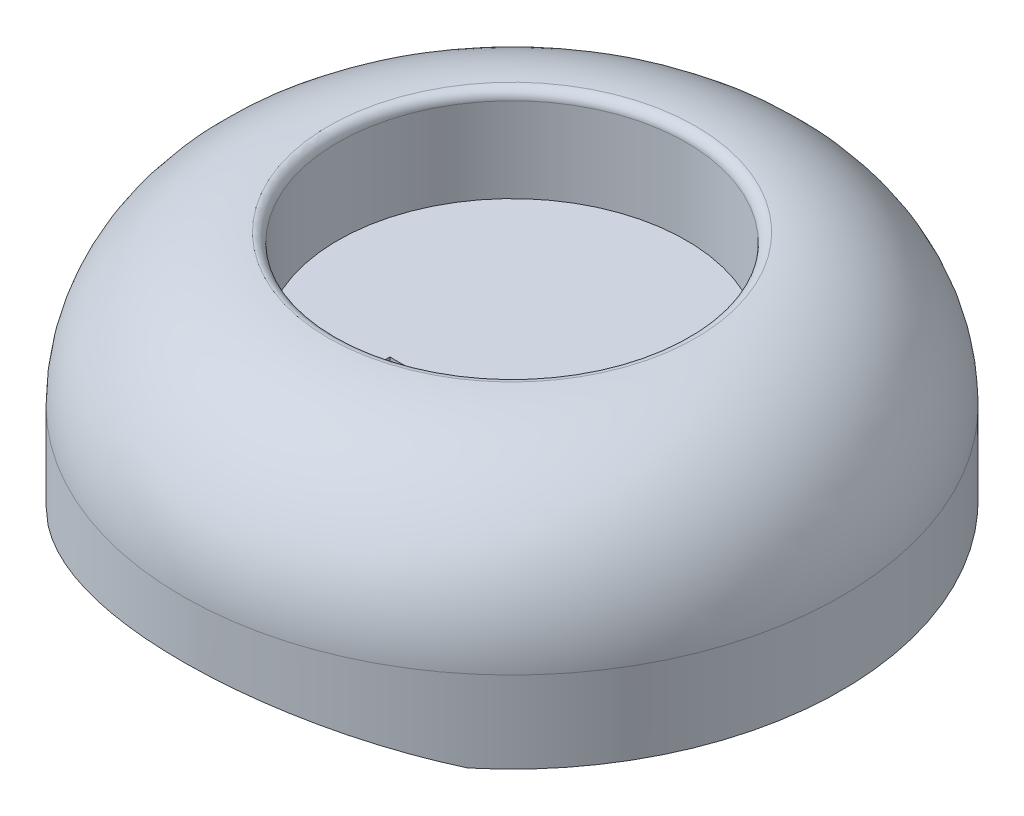
ISO-10303-21;
HEADER;
FILE_DESCRIPTION(('STEP AP214'),'2;1');
FILE_NAME('part.step','',(''),(''),'','','');
FILE_SCHEMA(('AUTOMOTIVE_DESIGN { 1 0 10303 214 1 1 1 1 }'));
ENDSEC;
DATA;
#1=APPLICATION_CONTEXT('core data for automotive mechanical design processes');
#2=APPLICATION_PROTOCOL_DEFINITION('international standard','automotive_design',2000,#1);
#3=PRODUCT_CONTEXT('',#1,'mechanical');
#4=PRODUCT('Part','Part','',(#3));
#5=PRODUCT_RELATED_PRODUCT_CATEGORY('part','',(#4));
#6=PRODUCT_DEFINITION_FORMATION('','',#4);
#7=PRODUCT_DEFINITION_CONTEXT('part definition',#1,'design');
#8=PRODUCT_DEFINITION('design','',#6,#7);
#9=PRODUCT_DEFINITION_SHAPE('','',#8);
#10=(LENGTH_UNIT() NAMED_UNIT(*) SI_UNIT(.MILLI.,.METRE.));
#11=(NAMED_UNIT(*) PLANE_ANGLE_UNIT() SI_UNIT($,.RADIAN.));
#12=(NAMED_UNIT(*) SI_UNIT($,.STERADIAN.) SOLID_ANGLE_UNIT());
#13=UNCERTAINTY_MEASURE_WITH_UNIT(LENGTH_MEASURE(1.E-05),#10,'distance_accuracy_value','');
#14=(GEOMETRIC_REPRESENTATION_CONTEXT(3) GLOBAL_UNCERTAINTY_ASSIGNED_CONTEXT((#13)) GLOBAL_UNIT_ASSIGNED_CONTEXT((#10,
#11,#12)) REPRESENTATION_CONTEXT('',''));
#15=CARTESIAN_POINT('',(0.,0.,0.));
#16=DIRECTION('',(0.,0.,1.));
#17=DIRECTION('',(1.,0.,0.));
#18=AXIS2_PLACEMENT_3D('',#15,#16,#17);
#19=CARTESIAN_POINT('',(0.,3.,0.));
#20=DIRECTION('',(0.,-1.,0.));
#21=DIRECTION('',(0.,0.,-1.));
#22=AXIS2_PLACEMENT_3D('',#19,#20,#21);
#23=CYLINDRICAL_SURFACE('',#22,35.);
#24=CARTESIAN_POINT('',(0.,-2.99218559171947,0.));
#25=DIRECTION('',(0.,1.,0.));
#26=DIRECTION('',(0.,0.,1.));
#27=AXIS2_PLACEMENT_3D('',#24,#25,#26);
#28=CIRCLE('',#27,35.);
#29=CARTESIAN_POINT('',(0.,-2.99218559171947,35.));
#30=VERTEX_POINT('',#29);
#31=EDGE_CURVE('E212',#30,#30,#28,.F.);
#32=ORIENTED_EDGE('',*,*,#31,.T.);
#33=EDGE_LOOP('',(#32));
#34=FACE_BOUND('',#33,.T.);
#35=CARTESIAN_POINT('',(0.,-11.6494555971038,0.));
#36=DIRECTION('',(0.,-1.,0.));
#37=DIRECTION('',(0.,0.,-1.));
#38=AXIS2_PLACEMENT_3D('',#35,#36,#37);
#39=CIRCLE('',#38,35.);
#40=CARTESIAN_POINT('',(22.2795185874538,-11.6494555971038,-26.9930185698321));
#41=VERTEX_POINT('',#40);
#42=CARTESIAN_POINT('',(22.2795185874538,-11.6494555971038,26.9930185698321));
#43=VERTEX_POINT('',#42);
#44=EDGE_CURVE('E153',#41,#43,#39,.T.);
#45=ORIENTED_EDGE('',*,*,#44,.F.);
#46=CARTESIAN_POINT('',(33.2264954516724,-15.,-10.9999999999998));
#47=CARTESIAN_POINT('',(33.070287844172,-14.9416871964574,-11.4718382677305));
#48=CARTESIAN_POINT('',(32.9041710792515,-14.8801344345767,-11.9399190820619));
#49=CARTESIAN_POINT('',(32.5524888540023,-14.751074376007,-12.8678553118098));
#50=CARTESIAN_POINT('',(32.366924399693,-14.6835673873559,-13.3277111512611));
#51=CARTESIAN_POINT('',(31.7818169143331,-14.472975846491,-14.6934141129782));
#52=CARTESIAN_POINT('',(31.3536757056429,-14.3217511034775,-15.5859516390508));
#53=CARTESIAN_POINT('',(30.4255681586325,-14.0026383410802,-17.3279516263963));
#54=CARTESIAN_POINT('',(29.9256992183594,-13.8347730117534,-18.1774704194476));
#55=CARTESIAN_POINT('',(28.857369460363,-13.487196124391,-19.8297767408111));
#56=CARTESIAN_POINT('',(28.28890288945,-13.3074835733194,-20.6325603411243));
#57=CARTESIAN_POINT('',(27.0878725852608,-12.9415529118996,-22.1858088325812));
#58=CARTESIAN_POINT('',(26.4553685677651,-12.7553409666115,-22.9363213844505));
#59=CARTESIAN_POINT('',(25.1298307218605,-12.3814117302299,-24.3814048315343));
#60=CARTESIAN_POINT('',(24.436798096591,-12.1936944691252,-25.0759768381633));
#61=CARTESIAN_POINT('',(22.9941410195863,-11.8217789680604,-26.405146057847));
#62=CARTESIAN_POINT('',(22.2444996923029,-11.6375817981396,-27.0397252585521));
#63=CARTESIAN_POINT('',(20.6932358100137,-11.2777055162001,-28.2445480018689));
#64=CARTESIAN_POINT('',(19.8916125982774,-11.1020265118476,-28.8147907314149));
#65=CARTESIAN_POINT('',(18.2255267935978,-10.7607017408015,-29.8970822606863));
#66=CARTESIAN_POINT('',(17.3601605642291,-10.5953095484316,-30.4078217997207));
#67=CARTESIAN_POINT('',(15.5860577132487,-10.2829474573065,-31.354194854625));
#68=CARTESIAN_POINT('',(14.6773203714802,-10.135977864597,-31.7898271228198));
#69=CARTESIAN_POINT('',(12.8230137224489,-9.86473589875074,-32.5819960995678));
#70=CARTESIAN_POINT('',(11.877455187954,-9.74045694665733,-32.9385557410069));
#71=CARTESIAN_POINT('',(9.95623542194806,-9.51821224744027,-33.5692630051182));
#72=CARTESIAN_POINT('',(8.98057578208915,-9.42024511167963,-33.843414977043));
#73=CARTESIAN_POINT('',(7.0508296343877,-9.2572892842676,-34.2961189186473));
#74=CARTESIAN_POINT('',(6.097722532224,-9.19102432115513,-34.4783902119659));
#75=CARTESIAN_POINT('',(4.17813094282077,-9.0870559242485,-34.7632651362802));
#76=CARTESIAN_POINT('',(3.2116468360348,-9.0493516798556,-34.8658710283091));
#77=CARTESIAN_POINT('',(1.27304273041972,-9.00358316871684,-34.9903209631909));
#78=CARTESIAN_POINT('',(0.300924249474003,-8.99551125982811,-35.0121858290638));
#79=CARTESIAN_POINT('',(-1.64153777444713,-9.00921839014143,-34.9749755320024));
#80=CARTESIAN_POINT('',(-2.61188136190451,-9.03099667068978,-34.9159024261369));
#81=CARTESIAN_POINT('',(-4.49923242050636,-9.10211846265883,-34.72197518562));
#82=CARTESIAN_POINT('',(-5.4166584290202,-9.15016317506512,-34.5906899954895));
#83=CARTESIAN_POINT('',(-7.23655753044753,-9.27163099450366,-34.256213536081));
#84=CARTESIAN_POINT('',(-8.13903116251387,-9.34505318437857,-34.0530248654318));
#85=CARTESIAN_POINT('',(-9.92300168167775,-9.51541374514183,-33.576576416683));
#86=CARTESIAN_POINT('',(-10.804498289911,-9.6123524284621,-33.3033157076279));
#87=CARTESIAN_POINT('',(-12.5409015305293,-9.82733279869941,-32.6890498146642));
#88=CARTESIAN_POINT('',(-13.3958074732976,-9.94537503239255,-32.3480428754794));
#89=CARTESIAN_POINT('',(-15.0889380561709,-10.2019712609943,-31.5942713058427));
#90=CARTESIAN_POINT('',(-15.9265882156743,-10.3408552705166,-31.1803290027825));
#91=CARTESIAN_POINT('',(-17.5640469115699,-10.6340732583566,-30.2881780457692));
#92=CARTESIAN_POINT('',(-18.3638550134748,-10.7884074140034,-29.8099686541692));
#93=CARTESIAN_POINT('',(-19.9217006530582,-11.1088891454027,-28.7922175457386));
#94=CARTESIAN_POINT('',(-20.6797150238464,-11.2750431585103,-28.2526423104519));
#95=CARTESIAN_POINT('',(-21.7817429373516,-11.5300154136964,-27.4002099374963));
#96=CARTESIAN_POINT('',(-22.143267816341,-11.6159667855657,-27.1088743592191));
#97=CARTESIAN_POINT('',(-22.8543384700506,-11.7893002763157,-26.5121609581194));
#98=CARTESIAN_POINT('',(-23.2038812861085,-11.876682740808,-26.2067797100548));
#99=CARTESIAN_POINT('',(-24.2731117253624,-12.1502462488741,-25.2344721130645));
#100=CARTESIAN_POINT('',(-24.9711533434693,-12.3379992602399,-24.5439222370284));
#101=CARTESIAN_POINT('',(-26.306921409847,-12.7123927880997,-23.1064612828754));
#102=CARTESIAN_POINT('',(-26.9446466858193,-12.8990332829048,-22.3595491098172));
#103=CARTESIAN_POINT('',(-27.8526096807546,-13.1741660942054,-21.2007737820457));
#104=CARTESIAN_POINT('',(-28.1470687238969,-13.2650425354061,-20.8082530331569));
#105=CARTESIAN_POINT('',(-28.7193780877013,-13.4445627189195,-20.0109486621318));
#106=CARTESIAN_POINT('',(-28.9972327183075,-13.5332070371288,-19.6061682636518));
#107=CARTESIAN_POINT('',(-29.8051130061001,-13.7948132919814,-18.3744156448791));
#108=CARTESIAN_POINT('',(-30.3097312668621,-13.9635331258057,-17.5296795526715));
#109=CARTESIAN_POINT('',(-31.2675213466198,-14.2915296767312,-15.76061578653));
#110=CARTESIAN_POINT('',(-31.7175119099852,-14.4500792740921,-14.8344250809907));
#111=CARTESIAN_POINT('',(-32.3304720178602,-14.6703433373851,-13.4166134966783));
#112=CARTESIAN_POINT('',(-32.524369619892,-14.7408058560363,-12.9395111091158));
#113=CARTESIAN_POINT('',(-32.891245631117,-14.8753459927725,-11.9762927376035));
#114=CARTESIAN_POINT('',(-33.0642182124596,-14.9394218312254,-11.4901742858574));
#115=CARTESIAN_POINT('',(-33.2264954516724,-15.,-10.9999999999998));
#116=B_SPLINE_CURVE_WITH_KNOTS('',3,(#46,#47,#48,#49,#50,#51,#52,#53,#54,#55,#56,#57,#58,#59,
#60,#61,#62,#63,#64,#65,#66,#67,#68,#69,#70,#71,#72,#73,#74,#75,#76,#77,#78,#79,#80,#81,#82,#83,
#84,#85,#86,#87,#88,#89,#90,#91,#92,#93,#94,#95,#96,#97,#98,#99,#100,#101,#102,#103,#104,#105,
#106,#107,#108,#109,#110,#111,#112,#113,#114,#115),.UNSPECIFIED.,.F.,.F.,(4,2,2,2,2,2,2,2,2,2,2,
2,2,2,2,2,2,2,2,2,2,2,2,2,2,2,2,2,2,2,2,2,2,2,4),(0.,1.50103586598857,3.00199412242077,
6.00215026801031,8.99827043359542,11.9946420545705,14.9882448138711,17.9817880822565,
20.9762273019758,23.9707043603145,27.0219909164407,30.073328155371,33.1237792753978,
36.1740693726364,39.0882781285942,42.0024041715612,44.9157786121871,47.8290790096861,
50.6098740789487,53.3905686591058,56.1713001846226,58.9521037671112,61.7827991952473,
64.6135271164102,67.4458086948596,68.8620689974095,70.2786765261898,73.2740989578896,
76.2695795961657,77.7663105180656,79.2626512364746,82.2539699272729,85.3750490710505,
86.9339667278187,88.4933175657309),.UNSPECIFIED.);
#117=CARTESIAN_POINT('',(-22.2795185874538,-11.6494555971038,-26.9930185698321));
#118=VERTEX_POINT('',#117);
#119=EDGE_CURVE('E169',#41,#118,#116,.T.);
#120=ORIENTED_EDGE('',*,*,#119,.T.);
#121=CARTESIAN_POINT('',(-22.2795185874538,-11.6494555971038,26.9930185698321));
#122=VERTEX_POINT('',#121);
#123=EDGE_CURVE('E157',#122,#118,#39,.T.);
#124=ORIENTED_EDGE('',*,*,#123,.F.);
#125=CARTESIAN_POINT('',(-33.2264954516724,-15.,10.9999999999998));
#126=CARTESIAN_POINT('',(-33.070287844172,-14.9416871964574,11.4718382677305));
#127=CARTESIAN_POINT('',(-32.9041710792515,-14.8801344345767,11.9399190820619));
#128=CARTESIAN_POINT('',(-32.5524888540023,-14.751074376007,12.8678553118098));
#129=CARTESIAN_POINT('',(-32.366924399693,-14.6835673873559,13.3277111512611));
#130=CARTESIAN_POINT('',(-31.7818169143331,-14.472975846491,14.6934141129782));
#131=CARTESIAN_POINT('',(-31.3536757056429,-14.3217511034775,15.5859516390508));
#132=CARTESIAN_POINT('',(-30.4255681586325,-14.0026383410802,17.3279516263963));
#133=CARTESIAN_POINT('',(-29.9256992183594,-13.8347730117534,18.1774704194476));
#134=CARTESIAN_POINT('',(-28.857369460363,-13.487196124391,19.8297767408111));
#135=CARTESIAN_POINT('',(-28.28890288945,-13.3074835733194,20.6325603411243));
#136=CARTESIAN_POINT('',(-27.0878725852608,-12.9415529118996,22.1858088325812));
#137=CARTESIAN_POINT('',(-26.4553685677651,-12.7553409666115,22.9363213844505));
#138=CARTESIAN_POINT('',(-25.1298307218605,-12.3814117302299,24.3814048315343));
#139=CARTESIAN_POINT('',(-24.436798096591,-12.1936944691252,25.0759768381633));
#140=CARTESIAN_POINT('',(-22.9941410195863,-11.8217789680604,26.405146057847));
#141=CARTESIAN_POINT('',(-22.2444996923029,-11.6375817981396,27.0397252585521));
#142=CARTESIAN_POINT('',(-20.6932358100137,-11.2777055162001,28.2445480018689));
#143=CARTESIAN_POINT('',(-19.8916125982774,-11.1020265118476,28.8147907314149));
#144=CARTESIAN_POINT('',(-18.2255267935978,-10.7607017408015,29.8970822606863));
#145=CARTESIAN_POINT('',(-17.3601605642291,-10.5953095484316,30.4078217997207));
#146=CARTESIAN_POINT('',(-15.5860577132487,-10.2829474573065,31.354194854625));
#147=CARTESIAN_POINT('',(-14.6773203714802,-10.135977864597,31.7898271228198));
#148=CARTESIAN_POINT('',(-12.8230137224489,-9.86473589875074,32.5819960995678));
#149=CARTESIAN_POINT('',(-11.877455187954,-9.74045694665733,32.9385557410069));
#150=CARTESIAN_POINT('',(-9.95623542194806,-9.51821224744027,33.5692630051182));
#151=CARTESIAN_POINT('',(-8.98057578208915,-9.42024511167963,33.843414977043));
#152=CARTESIAN_POINT('',(-7.0508296343877,-9.2572892842676,34.2961189186473));
#153=CARTESIAN_POINT('',(-6.097722532224,-9.19102432115513,34.4783902119659));
#154=CARTESIAN_POINT('',(-4.17813094282077,-9.0870559242485,34.7632651362802));
#155=CARTESIAN_POINT('',(-3.2116468360348,-9.0493516798556,34.8658710283091));
#156=CARTESIAN_POINT('',(-1.27304273041972,-9.00358316871684,34.9903209631909));
#157=CARTESIAN_POINT('',(-0.300924249474003,-8.99551125982811,35.0121858290638));
#158=CARTESIAN_POINT('',(1.64153777444713,-9.00921839014143,34.9749755320024));
#159=CARTESIAN_POINT('',(2.61188136190451,-9.03099667068978,34.9159024261369));
#160=CARTESIAN_POINT('',(4.49923242050636,-9.10211846265883,34.72197518562));
#161=CARTESIAN_POINT('',(5.4166584290202,-9.15016317506512,34.5906899954895));
#162=CARTESIAN_POINT('',(7.23655753044753,-9.27163099450366,34.256213536081));
#163=CARTESIAN_POINT('',(8.13903116251387,-9.34505318437857,34.0530248654318));
#164=CARTESIAN_POINT('',(9.92300168167775,-9.51541374514183,33.576576416683));
#165=CARTESIAN_POINT('',(10.804498289911,-9.6123524284621,33.3033157076279));
#166=CARTESIAN_POINT('',(12.5409015305293,-9.82733279869941,32.6890498146642));
#167=CARTESIAN_POINT('',(13.3958074732976,-9.94537503239255,32.3480428754794));
#168=CARTESIAN_POINT('',(15.0889380561709,-10.2019712609943,31.5942713058427));
#169=CARTESIAN_POINT('',(15.9265882156743,-10.3408552705166,31.1803290027825));
#170=CARTESIAN_POINT('',(17.5640469115699,-10.6340732583566,30.2881780457692));
#171=CARTESIAN_POINT('',(18.3638550134748,-10.7884074140034,29.8099686541692));
#172=CARTESIAN_POINT('',(19.9217006530582,-11.1088891454027,28.7922175457386));
#173=CARTESIAN_POINT('',(20.6797150238464,-11.2750431585103,28.2526423104519));
#174=CARTESIAN_POINT('',(21.7817429373516,-11.5300154136964,27.4002099374963));
#175=CARTESIAN_POINT('',(22.143267816341,-11.6159667855657,27.1088743592191));
#176=CARTESIAN_POINT('',(22.8543384700506,-11.7893002763157,26.5121609581194));
#177=CARTESIAN_POINT('',(23.2038812861085,-11.876682740808,26.2067797100548));
#178=CARTESIAN_POINT('',(24.2731117253624,-12.1502462488741,25.2344721130645));
#179=CARTESIAN_POINT('',(24.9711533434693,-12.3379992602399,24.5439222370284));
#180=CARTESIAN_POINT('',(26.306921409847,-12.7123927880997,23.1064612828754));
#181=CARTESIAN_POINT('',(26.9446466858193,-12.8990332829048,22.3595491098172));
#182=CARTESIAN_POINT('',(27.8526096807546,-13.1741660942054,21.2007737820457));
#183=CARTESIAN_POINT('',(28.1470687238969,-13.2650425354061,20.8082530331569));
#184=CARTESIAN_POINT('',(28.7193780877013,-13.4445627189195,20.0109486621318));
#185=CARTESIAN_POINT('',(28.9972327183075,-13.5332070371288,19.6061682636518));
#186=CARTESIAN_POINT('',(29.8051130061001,-13.7948132919814,18.3744156448791));
#187=CARTESIAN_POINT('',(30.3097312668621,-13.9635331258057,17.5296795526715));
#188=CARTESIAN_POINT('',(31.2675213466198,-14.2915296767312,15.76061578653));
#189=CARTESIAN_POINT('',(31.7175119099852,-14.4500792740921,14.8344250809907));
#190=CARTESIAN_POINT('',(32.3304720178602,-14.6703433373851,13.4166134966783));
#191=CARTESIAN_POINT('',(32.524369619892,-14.7408058560363,12.9395111091158));
#192=CARTESIAN_POINT('',(32.891245631117,-14.8753459927725,11.9762927376035));
#193=CARTESIAN_POINT('',(33.0642182124596,-14.9394218312254,11.4901742858574));
#194=CARTESIAN_POINT('',(33.2264954516724,-15.,10.9999999999998));
#195=B_SPLINE_CURVE_WITH_KNOTS('',3,(#125,#126,#127,#128,#129,#130,#131,#132,#133,#134,#135,
#136,#137,#138,#139,#140,#141,#142,#143,#144,#145,#146,#147,#148,#149,#150,#151,#152,#153,#154,
#155,#156,#157,#158,#159,#160,#161,#162,#163,#164,#165,#166,#167,#168,#169,#170,#171,#172,#173,
#174,#175,#176,#177,#178,#179,#180,#181,#182,#183,#184,#185,#186,#187,#188,#189,#190,#191,#192,
#193,#194),.UNSPECIFIED.,.F.,.F.,(4,2,2,2,2,2,2,2,2,2,2,2,2,2,2,2,2,2,2,2,2,2,2,2,2,2,2,2,2,2,2,
2,2,2,4),(0.,1.50103586598857,3.00199412242077,6.00215026801031,8.99827043359542,
11.9946420545705,14.9882448138711,17.9817880822565,20.9762273019758,23.9707043603145,
27.0219909164407,30.073328155371,33.1237792753978,36.1740693726364,39.0882781285942,
42.0024041715612,44.9157786121871,47.8290790096861,50.6098740789487,53.3905686591058,
56.1713001846226,58.9521037671112,61.7827991952473,64.6135271164102,67.4458086948596,
68.8620689974095,70.2786765261898,73.2740989578896,76.2695795961657,77.7663105180656,
79.2626512364746,82.2539699272729,85.3750490710505,86.9339667278187,88.4933175657309),.UNSPECIFIED.);
#196=EDGE_CURVE('E160',#122,#43,#195,.T.);
#197=ORIENTED_EDGE('',*,*,#196,.T.);
#198=EDGE_LOOP('',(#45,#120,#124,#197));
#199=FACE_BOUND('',#198,.T.);
#200=ADVANCED_FACE('F49',(#34,#199),#23,.T.);
#201=CARTESIAN_POINT('',(0.,-104.,-35.));
#202=DIRECTION('',(0.,0.,1.));
#203=DIRECTION('',(1.,0.,0.));
#204=AXIS2_PLACEMENT_3D('',#201,#202,#203);
#205=CYLINDRICAL_SURFACE('',#204,95.);
#206=DIRECTION('',(0.,0.,1.));
#207=VECTOR('',#206,1.);
#208=CARTESIAN_POINT('',(22.2795185874538,-11.6494555971038,-35.));
#209=LINE('',#208,#207);
#210=CARTESIAN_POINT('',(22.2795185874538,-11.6494555971038,23.6616367039835));
#211=VERTEX_POINT('',#210);
#212=EDGE_CURVE('E156',#43,#211,#209,.F.);
#213=ORIENTED_EDGE('',*,*,#212,.F.);
#214=ORIENTED_EDGE('',*,*,#196,.F.);
#215=DIRECTION('',(0.,0.,1.));
#216=VECTOR('',#215,1.);
#217=CARTESIAN_POINT('',(-22.2795185874538,-11.6494555971038,-35.));
#218=LINE('',#217,#216);
#219=CARTESIAN_POINT('',(-22.2795185874538,-11.6494555971038,23.6616367039835));
#220=VERTEX_POINT('',#219);
#221=EDGE_CURVE('E150',#220,#122,#218,.T.);
#222=ORIENTED_EDGE('',*,*,#221,.F.);
#223=CARTESIAN_POINT('',(0.,-8.99999999999997,32.5));
#224=CARTESIAN_POINT('',(0.88531094309566,-8.99999928977968,32.5000010370483));
#225=CARTESIAN_POINT('',(1.77060640750261,-9.01240339699505,32.4637970288554));
#226=CARTESIAN_POINT('',(3.53459194721164,-9.06167717540639,32.3193402093058));
#227=CARTESIAN_POINT('',(4.41328217651195,-9.0985462744112,32.2110890829983));
#228=CARTESIAN_POINT('',(6.15765800307995,-9.19574684254352,31.9235756759847));
#229=CARTESIAN_POINT('',(7.02334321236099,-9.25607901022094,31.744311281046));
#230=CARTESIAN_POINT('',(8.73555163413859,-9.39858243289754,31.3164311282994));
#231=CARTESIAN_POINT('',(9.58207464046565,-9.48075392274875,31.067814624703));
#232=CARTESIAN_POINT('',(11.2487200690982,-9.6645982825525,30.503915853471));
#233=CARTESIAN_POINT('',(12.0688865812897,-9.76623636669711,30.1887524004298));
#234=CARTESIAN_POINT('',(13.6791052009004,-9.98647701491515,29.4940836513536));
#235=CARTESIAN_POINT('',(14.4691574235499,-10.1050795140671,29.1145786015477));
#236=CARTESIAN_POINT('',(16.0144603369805,-10.356260341991,28.2940361550652));
#237=CARTESIAN_POINT('',(16.7697054313538,-10.4888409070154,27.8529889090231));
#238=CARTESIAN_POINT('',(18.2408451388116,-10.7646427967386,26.9125234941527));
#239=CARTESIAN_POINT('',(18.9567387176388,-10.9078644008784,26.4131037922261));
#240=CARTESIAN_POINT('',(20.3679318220489,-11.206227535141,25.3418098152937));
#241=CARTESIAN_POINT('',(21.0617937135384,-11.361605652521,24.7681010616163));
#242=CARTESIAN_POINT('',(22.0646122811582,-11.5972350189727,23.8664016603484));
#243=CARTESIAN_POINT('',(22.392572523743,-11.676209441031,23.558961703717));
#244=CARTESIAN_POINT('',(23.035503273896,-11.8345227699761,22.9307138095416));
#245=CARTESIAN_POINT('',(23.3504705935788,-11.9138617610671,22.6099026296552));
#246=CARTESIAN_POINT('',(24.2750653577167,-12.1516133111408,21.6282051450289));
#247=CARTESIAN_POINT('',(24.8644520234304,-12.309776215973,20.9479951618279));
#248=CARTESIAN_POINT('',(25.9852863109964,-12.6210999226034,19.5403255161225));
#249=CARTESIAN_POINT('',(26.5167341880898,-12.7742607464354,18.8128660617914));
#250=CARTESIAN_POINT('',(27.2754515570309,-12.9993285297492,17.678105815133));
#251=CARTESIAN_POINT('',(27.5253452178457,-13.0746505973342,17.2864486081173));
#252=CARTESIAN_POINT('',(28.0082924546511,-13.222253427729,16.4924662184217));
#253=CARTESIAN_POINT('',(28.2413500649033,-13.2945349173778,16.0901436231832));
#254=CARTESIAN_POINT('',(28.9147135079161,-13.5060171093036,14.867898096818));
#255=CARTESIAN_POINT('',(29.3292533447227,-13.6398685492922,14.0326325493446));
#256=CARTESIAN_POINT('',(30.0857413261065,-13.8889193192554,12.3275345251302));
#257=CARTESIAN_POINT('',(30.4277078230243,-14.0041233630292,11.4577108536566));
#258=CARTESIAN_POINT('',(31.0361020009639,-14.2121174095134,9.68939490445648));
#259=CARTESIAN_POINT('',(31.3025332851925,-14.3049084813438,8.79090399649984));
#260=CARTESIAN_POINT('',(31.749167678357,-14.4620502709056,7.00416138329376));
#261=CARTESIAN_POINT('',(31.9320775173566,-14.5272876423867,6.11666379569649));
#262=CARTESIAN_POINT('',(32.2232755498045,-14.6317476071554,4.3279842516215));
#263=CARTESIAN_POINT('',(32.3315653681648,-14.6709707669231,3.42680259356239));
#264=CARTESIAN_POINT('',(32.4723678201705,-14.7220578033295,1.61802083031138));
#265=CARTESIAN_POINT('',(32.5049019752911,-14.733929450267,0.710422621512716));
#266=CARTESIAN_POINT('',(32.4939050159786,-14.7299254982951,-1.1042369374811));
#267=CARTESIAN_POINT('',(32.4503761998104,-14.7140507377516,-2.01129830306873));
#268=CARTESIAN_POINT('',(32.2916839023467,-14.6565404633657,-3.77381884909994));
#269=CARTESIAN_POINT('',(32.1801006120719,-14.6161929539752,-4.6296454106742));
#270=CARTESIAN_POINT('',(31.8895751621713,-14.5121305675629,-6.32830358467707));
#271=CARTESIAN_POINT('',(31.7106355064299,-14.4484165591622,-7.17113567894575));
#272=CARTESIAN_POINT('',(31.2869863669771,-14.2995272789089,-8.83822527965439));
#273=CARTESIAN_POINT('',(31.0422711582997,-14.2143501389906,-9.66248116248832));
#274=CARTESIAN_POINT('',(30.4891565766833,-14.0250217999379,-11.28706300685));
#275=CARTESIAN_POINT('',(30.1807554331539,-13.9208700732833,-12.0873883023535));
#276=CARTESIAN_POINT('',(29.4969533239799,-13.6946208634692,-13.6724889264707));
#277=CARTESIAN_POINT('',(29.1205204380612,-13.5722529797323,-14.4567820885331));
#278=CARTESIAN_POINT('',(28.5105720083168,-13.3788507389948,-15.607237067662));
#279=CARTESIAN_POINT('',(28.2996946661866,-13.312738137345,-15.9864090615321));
#280=CARTESIAN_POINT('',(27.8631241280208,-13.1776538935426,-16.7357208369017));
#281=CARTESIAN_POINT('',(27.6374277224796,-13.1086816332465,-17.105858637811));
#282=CARTESIAN_POINT('',(26.9386875236265,-12.8981678586162,-18.2018625734323));
#283=CARTESIAN_POINT('',(26.4439670670196,-12.7530211223852,-18.9133676408594));
#284=CARTESIAN_POINT('',(25.39995493512,-12.456914181852,-20.2938734179077));
#285=CARTESIAN_POINT('',(24.8506612227536,-12.3059537606695,-20.9628725393663));
#286=CARTESIAN_POINT('',(23.9724131636989,-12.0738235360516,-21.9495262605568));
#287=CARTESIAN_POINT('',(23.6618954606239,-11.9933594847345,-22.2839139956581));
#288=CARTESIAN_POINT('',(23.0271400826598,-11.8324459058381,-22.9392433470055));
#289=CARTESIAN_POINT('',(22.7029056148786,-11.7519963792323,-23.2601880718097));
#290=CARTESIAN_POINT('',(21.710173282494,-11.5114505907764,-24.2022837540823));
#291=CARTESIAN_POINT('',(21.0216085039104,-11.3521469745374,-24.8027388847133));
#292=CARTESIAN_POINT('',(19.5954700987511,-11.040059746619,-25.9442110321));
#293=CARTESIAN_POINT('',(18.8578907808943,-10.8872768954871,-26.4852211270261));
#294=CARTESIAN_POINT('',(17.3382357013729,-10.5923745425307,-27.5040410246451));
#295=CARTESIAN_POINT('',(16.5561602553799,-10.4502549650736,-27.9818512756207));
#296=CARTESIAN_POINT('',(14.9436604606064,-10.1790926572342,-28.8755264014922));
#297=CARTESIAN_POINT('',(14.1127988476709,-10.0502109984807,-29.2906519287662));
#298=CARTESIAN_POINT('',(12.416307816698,-9.81099316294226,-30.0491028700974));
#299=CARTESIAN_POINT('',(11.550677917477,-9.70065724293486,-30.3924272900387));
#300=CARTESIAN_POINT('',(9.79114019150498,-9.50176120495641,-31.0040449204696));
#301=CARTESIAN_POINT('',(8.89724085869873,-9.41319461494527,-31.2723604344358));
#302=CARTESIAN_POINT('',(7.08771721631026,-9.26041759042454,-31.7314578256634));
#303=CARTESIAN_POINT('',(6.17209396817482,-9.19620596850639,-31.9222434828683));
#304=CARTESIAN_POINT('',(4.36830561360494,-9.09638319925789,-32.2174616298738));
#305=CARTESIAN_POINT('',(3.48078092305064,-9.05960603507679,-32.3254210279235));
#306=CARTESIAN_POINT('',(1.69918094150653,-9.01101762969457,-32.4678501897433));
#307=CARTESIAN_POINT('',(0.805105849787494,-8.99920563216276,-32.5023221798469));
#308=CARTESIAN_POINT('',(-0.982670901847958,-9.00087733980151,-32.4974352863462));
#309=CARTESIAN_POINT('',(-1.87637259856091,-9.01435701642535,-32.4580881609101));
#310=CARTESIAN_POINT('',(-3.65676652170062,-9.06622751618061,-32.305978816669));
#311=CARTESIAN_POINT('',(-4.54345882541975,-9.10461806423166,-32.1932174085473));
#312=CARTESIAN_POINT('',(-6.27602424381416,-9.20368597521681,-31.8999923779286));
#313=CARTESIAN_POINT('',(-7.12231230608969,-9.26363847438008,-31.7217270433408));
#314=CARTESIAN_POINT('',(-8.79634345891885,-9.40438747307228,-31.2988759261241));
#315=CARTESIAN_POINT('',(-9.6240870338705,-9.48518342746063,-31.0542918779889));
#316=CARTESIAN_POINT('',(-11.2557446655881,-9.66558403882619,-30.5008267413524));
#317=CARTESIAN_POINT('',(-12.059656670353,-9.76519031004183,-30.1919401343876));
#318=CARTESIAN_POINT('',(-13.6385997977896,-9.98072709276637,-29.5123278412499));
#319=CARTESIAN_POINT('',(-14.4136300765911,-10.0966580807809,-29.1416003499321));
#320=CARTESIAN_POINT('',(-15.9508583707537,-10.3453555190077,-28.3301176222795));
#321=CARTESIAN_POINT('',(-16.7121434592887,-10.478492294903,-27.8877405640107));
#322=CARTESIAN_POINT('',(-17.8240384663321,-10.686302826791,-27.1798981512438));
#323=CARTESIAN_POINT('',(-18.1896830904932,-10.7569278161787,-26.9365572829151));
#324=CARTESIAN_POINT('',(-18.9106019730717,-10.9004607172096,-26.4354283294217));
#325=CARTESIAN_POINT('',(-19.2658738952959,-10.9733691355905,-26.177637027253));
#326=CARTESIAN_POINT('',(-20.3153060103593,-11.1948312319103,-25.3832251527991));
#327=CARTESIAN_POINT('',(-20.9931130926317,-11.3461275173828,-24.8255471574173));
#328=CARTESIAN_POINT('',(-22.3010013702662,-11.6521977525727,-23.6576422269051));
#329=CARTESIAN_POINT('',(-22.93108121936,-11.8069718002297,-23.0474138104928));
#330=CARTESIAN_POINT('',(-23.8521846911672,-12.0425083167223,-22.0801802806382));
#331=CARTESIAN_POINT('',(-24.1618891207828,-12.1234465591395,-21.7408398726397));
#332=CARTESIAN_POINT('',(-24.7666417436766,-12.2846177044083,-21.0493326842314));
#333=CARTESIAN_POINT('',(-25.0616933653576,-12.3648507686044,-20.6971689379144));
#334=CARTESIAN_POINT('',(-25.9243104322204,-12.6036864469975,-19.6220349783128));
#335=CARTESIAN_POINT('',(-26.469380252853,-12.7604364487752,-18.8803777558882));
#336=CARTESIAN_POINT('',(-27.4954304987582,-13.064375337743,-17.3521932344264));
#337=CARTESIAN_POINT('',(-27.9764077495224,-13.2115637511622,-16.5656637156155));
#338=CARTESIAN_POINT('',(-28.8707326563038,-13.4919866760833,-14.952626651825));
#339=CARTESIAN_POINT('',(-29.2840814751616,-13.6252214274979,-14.1261197945546));
#340=CARTESIAN_POINT('',(-30.0393789268413,-13.8734571208312,-12.4394038538411));
#341=CARTESIAN_POINT('',(-30.3813953706567,-13.9884753547284,-11.5792277102187));
#342=CARTESIAN_POINT('',(-30.9914557787213,-14.1966944954034,-9.83042295941822));
#343=CARTESIAN_POINT('',(-31.2594994232034,-14.2898953078694,-8.94179422926473));
#344=CARTESIAN_POINT('',(-31.7188884768194,-14.4512899648293,-7.14306379538944));
#345=CARTESIAN_POINT('',(-31.9102648726685,-14.5194939113926,-6.23297092466357));
#346=CARTESIAN_POINT('',(-32.2144529400059,-14.6285545601312,-4.39814216187316));
#347=CARTESIAN_POINT('',(-32.327268860332,-14.6694127412608,-3.47340706448075));
#348=CARTESIAN_POINT('',(-32.4691647124526,-14.720894839053,-1.66709094234046));
#349=CARTESIAN_POINT('',(-32.5024427936158,-14.7330342040635,-0.785880393319468));
#350=CARTESIAN_POINT('',(-32.4972783344967,-14.7311535528099,0.976283315602836));
#351=CARTESIAN_POINT('',(-32.4588385024845,-14.7171345243603,1.85723648396711));
#352=CARTESIAN_POINT('',(-32.3106346346368,-14.6633946737513,3.61225613761083));
#353=CARTESIAN_POINT('',(-32.2008754163181,-14.6236755875927,4.48632308400821));
#354=CARTESIAN_POINT('',(-31.911119326363,-14.5198117264607,6.22125040930184));
#355=CARTESIAN_POINT('',(-31.7311222722654,-14.455666888035,7.08211075388446));
#356=CARTESIAN_POINT('',(-31.3071261005779,-14.306560110539,8.76653537640956));
#357=CARTESIAN_POINT('',(-31.0645619230476,-14.2220674027539,9.5905033934565));
#358=CARTESIAN_POINT('',(-30.5158204085671,-14.0340689692722,11.2147005683211));
#359=CARTESIAN_POINT('',(-30.2096443603673,-13.9305636287687,12.0149302066932));
#360=CARTESIAN_POINT('',(-29.536002279156,-13.7074178984042,13.5869780746334));
#361=CARTESIAN_POINT('',(-29.1685256263061,-13.5877747134796,14.3587913529641));
#362=CARTESIAN_POINT('',(-28.3749671897465,-13.3355938993357,15.8694476718525));
#363=CARTESIAN_POINT('',(-27.9488831833238,-13.2030557811255,16.6082894605418));
#364=CARTESIAN_POINT('',(-27.0201433327412,-12.9222440104695,18.0818763723606));
#365=CARTESIAN_POINT('',(-26.5148843503578,-12.7735286597455,18.81490320601));
#366=CARTESIAN_POINT('',(-25.7139051787586,-12.545792105207,19.880712993717));
#367=CARTESIAN_POINT('',(-25.4397134825392,-12.469098161464,20.2303801472128));
#368=CARTESIAN_POINT('',(-24.8772837130367,-12.3146367493435,20.9181288564308));
#369=CARTESIAN_POINT('',(-24.5890423828612,-12.236869035075,21.2562076945933));
#370=CARTESIAN_POINT('',(-23.7039310217213,-12.0027388418934,22.2522491647756));
#371=CARTESIAN_POINT('',(-23.0866432596773,-11.8455405915394,22.8920571356796));
#372=CARTESIAN_POINT('',(-21.8014712196508,-11.5330706732099,24.1191880987403));
#373=CARTESIAN_POINT('',(-21.1335864528262,-11.3777990238652,24.7065105836898));
#374=CARTESIAN_POINT('',(-20.0823185279095,-11.1461545437592,25.557096949401));
#375=CARTESIAN_POINT('',(-19.7158439111407,-11.0676039838119,25.8408661972267));
#376=CARTESIAN_POINT('',(-18.9708938876527,-10.9126757753572,26.3926127074605));
#377=CARTESIAN_POINT('',(-18.5924213366835,-10.8362976178646,26.6605936850269));
#378=CARTESIAN_POINT('',(-17.4396642996877,-10.6111856455306,27.4402714951248));
#379=CARTESIAN_POINT('',(-16.6479869694577,-10.466462428601,27.9277464683577));
#380=CARTESIAN_POINT('',(-15.0239960655217,-10.1919098129575,28.833908639939));
#381=CARTESIAN_POINT('',(-14.1916882404165,-10.062078315947,29.2526055329664));
#382=CARTESIAN_POINT('',(-12.4919097048927,-9.82097507711177,30.017839047031));
#383=CARTESIAN_POINT('',(-11.6244403570335,-9.70970261695077,30.3643784610861));
#384=CARTESIAN_POINT('',(-9.88450751965666,-9.51168170642844,30.9737483275766));
#385=CARTESIAN_POINT('',(-9.01281483042074,-9.4243509511114,31.2385907682874));
#386=CARTESIAN_POINT('',(-7.24836120011981,-9.27278548335666,31.6945019104217));
#387=CARTESIAN_POINT('',(-6.35560061924825,-9.20855037636181,31.88557187215));
#388=CARTESIAN_POINT('',(-4.55598344020185,-9.10503120147978,32.1920165142004));
#389=CARTESIAN_POINT('',(-3.6491306111767,-9.06574057566304,32.3074110899219));
#390=CARTESIAN_POINT('',(-1.8281795762354,-9.01322564156711,32.4614014135798));
#391=CARTESIAN_POINT('',(-0.914081537577586,-9.0000007333008,32.49999892925));
#392=CARTESIAN_POINT('',(0.,-8.99999999999997,32.5));
#393=B_SPLINE_CURVE_WITH_KNOTS('',3,(#223,#224,#225,#226,#227,#228,#229,#230,#231,#232,#233,
#234,#235,#236,#237,#238,#239,#240,#241,#242,#243,#244,#245,#246,#247,#248,#249,#250,#251,#252,
#253,#254,#255,#256,#257,#258,#259,#260,#261,#262,#263,#264,#265,#266,#267,#268,#269,#270,#271,
#272,#273,#274,#275,#276,#277,#278,#279,#280,#281,#282,#283,#284,#285,#286,#287,#288,#289,#290,
#291,#292,#293,#294,#295,#296,#297,#298,#299,#300,#301,#302,#303,#304,#305,#306,#307,#308,#309,
#310,#311,#312,#313,#314,#315,#316,#317,#318,#319,#320,#321,#322,#323,#324,#325,#326,#327,#328,
#329,#330,#331,#332,#333,#334,#335,#336,#337,#338,#339,#340,#341,#342,#343,#344,#345,#346,#347,
#348,#349,#350,#351,#352,#353,#354,#355,#356,#357,#358,#359,#360,#361,#362,#363,#364,#365,#366,
#367,#368,#369,#370,#371,#372,#373,#374,#375,#376,#377,#378,#379,#380,#381,#382,#383,#384,#385,
#386,#387,#388,#389,#390,#391,#392),.UNSPECIFIED.,.T.,.F.,(4,2,2,2,2,2,2,2,2,2,2,2,2,2,2,2,2,2,
2,2,2,2,2,2,2,2,2,2,2,2,2,2,2,2,2,2,2,2,2,2,2,2,2,2,2,2,2,2,2,2,2,2,2,2,2,2,2,2,2,2,2,2,2,2,2,2,
2,2,2,2,2,2,2,2,2,2,2,2,2,2,2,2,2,2,4),(0.,2.65508317469185,5.31010425405897,7.96520438560638,
10.6203330702778,13.2707607109099,15.9211782088381,18.5720203737026,21.2229321761213,
23.9604780851226,25.3293966515041,26.6986491158214,29.436882752039,32.1751043248714,
33.586682861768,34.9979220258861,37.8201637637608,40.6416909607044,43.4630835415322,
46.1850954674127,48.9070481173827,51.6282273916797,54.3493244461678,56.9383220615968,
59.5272234439396,62.1163502318303,64.705549012075,67.3379432684471,68.6542683396904,
69.9708794464149,72.6039359287054,75.2370907329057,76.6268406053638,78.0162673179697,
80.7949472278829,83.5739503474903,86.3529337543014,89.1624910965954,91.9720873357933,
94.7808472665932,97.5894702407601,100.270593359568,102.951635251407,105.632250133727,
108.312835415636,110.910640018723,113.508376685608,116.106336382948,118.704371928403,
121.372623707489,122.70688958777,124.041453695692,126.710472234235,129.379566031229,
130.778693569223,132.177492187789,134.974903651428,137.772453619542,140.569955479978,
143.364785694429,146.159627990092,148.953339547814,151.746899999664,154.389398222705,
157.031796659602,159.674016625024,162.316243454351,164.902558421033,167.488820995143,
170.075532084717,172.662341303659,175.366933867489,176.719384325876,178.072149805356,
180.777527413582,183.482931163099,184.892867960341,186.302471647404,189.121470319374,
191.940071295131,194.758563150287,197.500761662463,200.242913325748,202.984343775703,
205.725711121996),.UNSPECIFIED.);
#394=EDGE_CURVE('E155',#220,#211,#393,.T.);
#395=ORIENTED_EDGE('',*,*,#394,.T.);
#396=EDGE_LOOP('',(#213,#214,#222,#395));
#397=FACE_BOUND('',#396,.T.);
#398=ADVANCED_FACE('F178',(#397),#205,.F.);
#399=CARTESIAN_POINT('',(22.2795185874538,-11.6494555971038,-23.6616367039835));
#400=VERTEX_POINT('',#399);
#401=EDGE_CURVE('E158',#400,#41,#209,.F.);
#402=ORIENTED_EDGE('',*,*,#401,.F.);
#403=CARTESIAN_POINT('',(-22.2795185874538,-11.6494555971038,-23.6616367039835));
#404=VERTEX_POINT('',#403);
#405=EDGE_CURVE('E170',#400,#404,#393,.T.);
#406=ORIENTED_EDGE('',*,*,#405,.T.);
#407=EDGE_CURVE('E152',#118,#404,#218,.T.);
#408=ORIENTED_EDGE('',*,*,#407,.F.);
#409=ORIENTED_EDGE('',*,*,#119,.F.);
#410=EDGE_LOOP('',(#402,#406,#408,#409));
#411=FACE_BOUND('',#410,.T.);
#412=ADVANCED_FACE('F183',(#411),#205,.F.);
#413=CARTESIAN_POINT('',(0.,-15.,0.));
#414=DIRECTION('',(0.,1.,0.));
#415=DIRECTION('',(0.,0.,1.));
#416=AXIS2_PLACEMENT_3D('',#413,#414,#415);
#417=CYLINDRICAL_SURFACE('',#416,32.5);
#418=CARTESIAN_POINT('',(0.,0.,0.));
#419=DIRECTION('',(0.,-1.,0.));
#420=DIRECTION('',(0.,0.,-1.));
#421=AXIS2_PLACEMENT_3D('',#418,#419,#420);
#422=CIRCLE('',#421,32.5);
#423=CARTESIAN_POINT('',(0.,0.,-32.5));
#424=VERTEX_POINT('',#423);
#425=EDGE_CURVE('E198',#424,#424,#422,.T.);
#426=ORIENTED_EDGE('',*,*,#425,.F.);
#427=EDGE_LOOP('',(#426));
#428=FACE_BOUND('',#427,.T.);
#429=ORIENTED_EDGE('',*,*,#405,.F.);
#430=CARTESIAN_POINT('',(0.,-11.6494555971038,0.));
#431=DIRECTION('',(0.,-1.,0.));
#432=DIRECTION('',(0.,0.,-1.));
#433=AXIS2_PLACEMENT_3D('',#430,#431,#432);
#434=CIRCLE('',#433,32.5);
#435=EDGE_CURVE('E202',#400,#211,#434,.T.);
#436=ORIENTED_EDGE('',*,*,#435,.T.);
#437=ORIENTED_EDGE('',*,*,#394,.F.);
#438=EDGE_CURVE('E199',#220,#404,#434,.T.);
#439=ORIENTED_EDGE('',*,*,#438,.T.);
#440=EDGE_LOOP('',(#429,#436,#437,#439));
#441=FACE_BOUND('',#440,.T.);
#442=ADVANCED_FACE('F187',(#428,#441),#417,.F.);
#443=CARTESIAN_POINT('',(0.,0.,0.));
#444=DIRECTION('',(0.,1.,0.));
#445=DIRECTION('',(0.,0.,1.));
#446=AXIS2_PLACEMENT_3D('',#443,#444,#445);
#447=PLANE('',#446);
#448=DIRECTION('',(-1.,0.,0.));
#449=VECTOR('',#448,1.);
#450=CARTESIAN_POINT('',(-5.00579183325768,0.,14.17));
#451=LINE('',#450,#449);
#452=CARTESIAN_POINT('',(4.99420816674232,0.,14.17));
#453=VERTEX_POINT('',#452);
#454=CARTESIAN_POINT('',(-5.00579183325768,0.,14.17));
#455=VERTEX_POINT('',#454);
#456=EDGE_CURVE('E125',#453,#455,#451,.T.);
#457=ORIENTED_EDGE('',*,*,#456,.F.);
#458=DIRECTION('',(0.,0.,1.));
#459=VECTOR('',#458,1.);
#460=CARTESIAN_POINT('',(4.99420816674232,0.,14.17));
#461=LINE('',#460,#459);
#462=CARTESIAN_POINT('',(4.99420816674232,0.,7.97));
#463=VERTEX_POINT('',#462);
#464=EDGE_CURVE('E64',#463,#453,#461,.T.);
#465=ORIENTED_EDGE('',*,*,#464,.F.);
#466=DIRECTION('',(1.,0.,0.));
#467=VECTOR('',#466,1.);
#468=CARTESIAN_POINT('',(-5.00579183325768,0.,7.97));
#469=LINE('',#468,#467);
#470=CARTESIAN_POINT('',(-5.00579183325768,0.,7.97));
#471=VERTEX_POINT('',#470);
#472=EDGE_CURVE('E132',#471,#463,#469,.T.);
#473=ORIENTED_EDGE('',*,*,#472,.F.);
#474=DIRECTION('',(0.,0.,-1.));
#475=VECTOR('',#474,1.);
#476=CARTESIAN_POINT('',(-5.00579183325768,0.,14.17));
#477=LINE('',#476,#475);
#478=EDGE_CURVE('E116',#455,#471,#477,.T.);
#479=ORIENTED_EDGE('',*,*,#478,.F.);
#480=EDGE_LOOP('',(#457,#465,#473,#479));
#481=FACE_BOUND('',#480,.T.);
#482=CARTESIAN_POINT('',(0.,0.,0.));
#483=DIRECTION('',(0.,1.,0.));
#484=DIRECTION('',(0.,0.,1.));
#485=AXIS2_PLACEMENT_3D('',#482,#483,#484);
#486=CIRCLE('',#485,6.5);
#487=CARTESIAN_POINT('',(0.,0.,6.5));
#488=VERTEX_POINT('',#487);
#489=EDGE_CURVE('E215',#488,#488,#486,.F.);
#490=ORIENTED_EDGE('',*,*,#489,.F.);
#491=EDGE_LOOP('',(#490));
#492=FACE_BOUND('',#491,.T.);
#493=ORIENTED_EDGE('',*,*,#425,.T.);
#494=EDGE_LOOP('',(#493));
#495=FACE_BOUND('',#494,.T.);
#496=ADVANCED_FACE('F129',(#481,#492,#495),#447,.F.);
#497=CARTESIAN_POINT('',(-35.,-11.6494555971038,26.9930185698321));
#498=DIRECTION('',(0.,-1.,0.));
#499=DIRECTION('',(0.,0.,-1.));
#500=AXIS2_PLACEMENT_3D('',#497,#498,#499);
#501=PLANE('',#500);
#502=ORIENTED_EDGE('',*,*,#123,.T.);
#503=ORIENTED_EDGE('',*,*,#407,.T.);
#504=ORIENTED_EDGE('',*,*,#438,.F.);
#505=ORIENTED_EDGE('',*,*,#221,.T.);
#506=EDGE_LOOP('',(#502,#503,#504,#505));
#507=FACE_BOUND('',#506,.T.);
#508=ADVANCED_FACE('F269',(#507),#501,.T.);
#509=ORIENTED_EDGE('',*,*,#44,.T.);
#510=ORIENTED_EDGE('',*,*,#212,.T.);
#511=ORIENTED_EDGE('',*,*,#435,.F.);
#512=ORIENTED_EDGE('',*,*,#401,.T.);
#513=EDGE_LOOP('',(#509,#510,#511,#512));
#514=FACE_BOUND('',#513,.T.);
#515=ADVANCED_FACE('F185',(#514),#501,.T.);
#516=CARTESIAN_POINT('',(0.,3.,0.));
#517=DIRECTION('',(0.,1.,0.));
#518=DIRECTION('',(0.,0.,1.));
#519=AXIS2_PLACEMENT_3D('',#516,#517,#518);
#520=PLANE('',#519);
#521=DIRECTION('',(0.,0.,-1.));
#522=VECTOR('',#521,1.);
#523=CARTESIAN_POINT('',(4.99420816674232,3.,0.));
#524=LINE('',#523,#522);
#525=CARTESIAN_POINT('',(4.99420816674232,3.,14.17));
#526=VERTEX_POINT('',#525);
#527=CARTESIAN_POINT('',(4.99420816674232,3.,7.97));
#528=VERTEX_POINT('',#527);
#529=EDGE_CURVE('E12',#526,#528,#524,.T.);
#530=ORIENTED_EDGE('',*,*,#529,.F.);
#531=DIRECTION('',(1.,0.,0.));
#532=VECTOR('',#531,1.);
#533=CARTESIAN_POINT('',(0.,3.,14.17));
#534=LINE('',#533,#532);
#535=CARTESIAN_POINT('',(-5.00579183325768,3.,14.17));
#536=VERTEX_POINT('',#535);
#537=EDGE_CURVE('E218',#536,#526,#534,.T.);
#538=ORIENTED_EDGE('',*,*,#537,.F.);
#539=DIRECTION('',(0.,0.,1.));
#540=VECTOR('',#539,1.);
#541=CARTESIAN_POINT('',(-5.00579183325768,3.,0.));
#542=LINE('',#541,#540);
#543=CARTESIAN_POINT('',(-5.00579183325768,3.,7.97));
#544=VERTEX_POINT('',#543);
#545=EDGE_CURVE('E119',#544,#536,#542,.T.);
#546=ORIENTED_EDGE('',*,*,#545,.F.);
#547=DIRECTION('',(-1.,0.,0.));
#548=VECTOR('',#547,1.);
#549=CARTESIAN_POINT('',(0.,3.,7.97));
#550=LINE('',#549,#548);
#551=EDGE_CURVE('E57',#528,#544,#550,.T.);
#552=ORIENTED_EDGE('',*,*,#551,.F.);
#553=EDGE_LOOP('',(#530,#538,#546,#552));
#554=FACE_BOUND('',#553,.T.);
#555=CARTESIAN_POINT('',(0.,3.,0.));
#556=DIRECTION('',(0.,1.,0.));
#557=DIRECTION('',(0.,0.,1.));
#558=AXIS2_PLACEMENT_3D('',#555,#556,#557);
#559=CIRCLE('',#558,18.5);
#560=CARTESIAN_POINT('',(0.,3.,18.5));
#561=VERTEX_POINT('',#560);
#562=EDGE_CURVE('E203',#561,#561,#559,.F.);
#563=ORIENTED_EDGE('',*,*,#562,.F.);
#564=EDGE_LOOP('',(#563));
#565=FACE_BOUND('',#564,.T.);
#566=ADVANCED_FACE('F226',(#554,#565),#520,.T.);
#567=CARTESIAN_POINT('',(0.,13.,0.));
#568=DIRECTION('',(0.,-1.,0.));
#569=DIRECTION('',(0.,0.,-1.));
#570=AXIS2_PLACEMENT_3D('',#567,#568,#569);
#571=CYLINDRICAL_SURFACE('',#570,18.5);
#572=CARTESIAN_POINT('',(0.,12.,0.));
#573=DIRECTION('',(0.,1.,0.));
#574=DIRECTION('',(0.,0.,1.));
#575=AXIS2_PLACEMENT_3D('',#572,#573,#574);
#576=CIRCLE('',#575,18.5);
#577=CARTESIAN_POINT('',(0.,12.,18.5));
#578=VERTEX_POINT('',#577);
#579=EDGE_CURVE('E206',#578,#578,#576,.T.);
#580=ORIENTED_EDGE('',*,*,#579,.T.);
#581=EDGE_LOOP('',(#580));
#582=FACE_BOUND('',#581,.T.);
#583=ORIENTED_EDGE('',*,*,#562,.T.);
#584=EDGE_LOOP('',(#583));
#585=FACE_BOUND('',#584,.T.);
#586=ADVANCED_FACE('F276',(#582,#585),#571,.F.);
#587=CARTESIAN_POINT('',(0.,12.,0.));
#588=DIRECTION('',(0.,1.,0.));
#589=DIRECTION('',(0.,0.,1.));
#590=AXIS2_PLACEMENT_3D('',#587,#588,#589);
#591=TOROIDAL_SURFACE('',#590,19.5,1.);
#592=CARTESIAN_POINT('',(0.,13.,0.));
#593=DIRECTION('',(0.,1.,0.));
#594=DIRECTION('',(0.,0.,1.));
#595=AXIS2_PLACEMENT_3D('',#592,#593,#594);
#596=CIRCLE('',#595,19.5);
#597=CARTESIAN_POINT('',(0.,13.,19.5));
#598=VERTEX_POINT('',#597);
#599=EDGE_CURVE('E209',#598,#598,#596,.F.);
#600=ORIENTED_EDGE('',*,*,#599,.F.);
#601=EDGE_LOOP('',(#600));
#602=FACE_BOUND('',#601,.T.);
#603=ORIENTED_EDGE('',*,*,#579,.F.);
#604=EDGE_LOOP('',(#603));
#605=FACE_BOUND('',#604,.T.);
#606=ADVANCED_FACE('F362',(#602,#605),#591,.T.);
#607=CARTESIAN_POINT('',(0.,-2.99218559171947,0.));
#608=DIRECTION('',(0.,1.,0.));
#609=DIRECTION('',(0.,0.,1.));
#610=AXIS2_PLACEMENT_3D('',#607,#608,#609);
#611=TOROIDAL_SURFACE('',#610,19.,16.);
#612=ORIENTED_EDGE('',*,*,#31,.F.);
#613=EDGE_LOOP('',(#612));
#614=FACE_BOUND('',#613,.T.);
#615=ORIENTED_EDGE('',*,*,#599,.T.);
#616=EDGE_LOOP('',(#615));
#617=FACE_BOUND('',#616,.T.);
#618=ADVANCED_FACE('F51',(#614,#617),#611,.T.);
#619=CARTESIAN_POINT('',(0.,-2.,0.));
#620=DIRECTION('',(0.,1.,0.));
#621=DIRECTION('',(0.,0.,1.));
#622=AXIS2_PLACEMENT_3D('',#619,#620,#621);
#623=CYLINDRICAL_SURFACE('',#622,6.5);
#624=CARTESIAN_POINT('',(0.,-2.,0.));
#625=DIRECTION('',(0.,-1.,0.));
#626=DIRECTION('',(0.,0.,-1.));
#627=AXIS2_PLACEMENT_3D('',#624,#625,#626);
#628=CIRCLE('',#627,6.5);
#629=CARTESIAN_POINT('',(0.,-2.,-6.5));
#630=VERTEX_POINT('',#629);
#631=EDGE_CURVE('E145',#630,#630,#628,.T.);
#632=ORIENTED_EDGE('',*,*,#631,.F.);
#633=EDGE_LOOP('',(#632));
#634=FACE_BOUND('',#633,.T.);
#635=ORIENTED_EDGE('',*,*,#489,.T.);
#636=EDGE_LOOP('',(#635));
#637=FACE_BOUND('',#636,.T.);
#638=ADVANCED_FACE('F345',(#634,#637),#623,.T.);
#639=CARTESIAN_POINT('',(0.,-2.,0.));
#640=DIRECTION('',(0.,-1.,0.));
#641=DIRECTION('',(0.,0.,-1.));
#642=AXIS2_PLACEMENT_3D('',#639,#640,#641);
#643=PLANE('',#642);
#644=CARTESIAN_POINT('',(0.,-2.,0.));
#645=DIRECTION('',(0.,-1.,0.));
#646=DIRECTION('',(0.,0.,-1.));
#647=AXIS2_PLACEMENT_3D('',#644,#645,#646);
#648=CIRCLE('',#647,5.);
#649=CARTESIAN_POINT('',(0.,-2.,-5.));
#650=VERTEX_POINT('',#649);
#651=EDGE_CURVE('E139',#650,#650,#648,.T.);
#652=ORIENTED_EDGE('',*,*,#651,.F.);
#653=EDGE_LOOP('',(#652));
#654=FACE_BOUND('',#653,.T.);
#655=ORIENTED_EDGE('',*,*,#631,.T.);
#656=EDGE_LOOP('',(#655));
#657=FACE_BOUND('',#656,.T.);
#658=ADVANCED_FACE('F336',(#654,#657),#643,.T.);
#659=CARTESIAN_POINT('',(0.,0.,0.));
#660=DIRECTION('',(0.,-1.,0.));
#661=DIRECTION('',(0.,0.,-1.));
#662=AXIS2_PLACEMENT_3D('',#659,#660,#661);
#663=CYLINDRICAL_SURFACE('',#662,5.);
#664=CARTESIAN_POINT('',(0.,0.,0.));
#665=DIRECTION('',(0.,-1.,0.));
#666=DIRECTION('',(0.,0.,-1.));
#667=AXIS2_PLACEMENT_3D('',#664,#665,#666);
#668=CIRCLE('',#667,5.);
#669=CARTESIAN_POINT('',(0.,0.,-5.));
#670=VERTEX_POINT('',#669);
#671=EDGE_CURVE('E142',#670,#670,#668,.T.);
#672=ORIENTED_EDGE('',*,*,#671,.F.);
#673=EDGE_LOOP('',(#672));
#674=FACE_BOUND('',#673,.T.);
#675=ORIENTED_EDGE('',*,*,#651,.T.);
#676=EDGE_LOOP('',(#675));
#677=FACE_BOUND('',#676,.T.);
#678=ADVANCED_FACE('F237',(#674,#677),#663,.F.);
#679=CARTESIAN_POINT('',(0.,0.,0.));
#680=DIRECTION('',(0.,-1.,0.));
#681=DIRECTION('',(0.,0.,-1.));
#682=AXIS2_PLACEMENT_3D('',#679,#680,#681);
#683=PLANE('',#682);
#684=ORIENTED_EDGE('',*,*,#671,.T.);
#685=EDGE_LOOP('',(#684));
#686=FACE_BOUND('',#685,.T.);
#687=ADVANCED_FACE('F230',(#686),#683,.T.);
#688=CARTESIAN_POINT('',(4.99420816674232,18.,14.17));
#689=DIRECTION('',(1.,0.,0.));
#690=DIRECTION('',(0.,0.,-1.));
#691=AXIS2_PLACEMENT_3D('',#688,#689,#690);
#692=PLANE('',#691);
#693=ORIENTED_EDGE('',*,*,#529,.T.);
#694=DIRECTION('',(0.,-1.,0.));
#695=VECTOR('',#694,1.);
#696=CARTESIAN_POINT('',(4.99420816674232,18.,7.97));
#697=LINE('',#696,#695);
#698=EDGE_CURVE('E137',#528,#463,#697,.T.);
#699=ORIENTED_EDGE('',*,*,#698,.T.);
#700=ORIENTED_EDGE('',*,*,#464,.T.);
#701=DIRECTION('',(0.,-1.,0.));
#702=VECTOR('',#701,1.);
#703=CARTESIAN_POINT('',(4.99420816674232,18.,14.17));
#704=LINE('',#703,#702);
#705=EDGE_CURVE('E122',#526,#453,#704,.T.);
#706=ORIENTED_EDGE('',*,*,#705,.F.);
#707=EDGE_LOOP('',(#693,#699,#700,#706));
#708=FACE_BOUND('',#707,.T.);
#709=ADVANCED_FACE('F228',(#708),#692,.F.);
#710=CARTESIAN_POINT('',(-5.00579183325768,18.,7.97));
#711=DIRECTION('',(0.,0.,-1.));
#712=DIRECTION('',(-1.,0.,0.));
#713=AXIS2_PLACEMENT_3D('',#710,#711,#712);
#714=PLANE('',#713);
#715=ORIENTED_EDGE('',*,*,#551,.T.);
#716=DIRECTION('',(0.,-1.,0.));
#717=VECTOR('',#716,1.);
#718=CARTESIAN_POINT('',(-5.00579183325768,18.,7.97));
#719=LINE('',#718,#717);
#720=EDGE_CURVE('E121',#544,#471,#719,.T.);
#721=ORIENTED_EDGE('',*,*,#720,.T.);
#722=ORIENTED_EDGE('',*,*,#472,.T.);
#723=ORIENTED_EDGE('',*,*,#698,.F.);
#724=EDGE_LOOP('',(#715,#721,#722,#723));
#725=FACE_BOUND('',#724,.T.);
#726=ADVANCED_FACE('F223',(#725),#714,.F.);
#727=CARTESIAN_POINT('',(-5.00579183325768,18.,14.17));
#728=DIRECTION('',(-1.,0.,0.));
#729=DIRECTION('',(0.,0.,1.));
#730=AXIS2_PLACEMENT_3D('',#727,#728,#729);
#731=PLANE('',#730);
#732=ORIENTED_EDGE('',*,*,#545,.T.);
#733=DIRECTION('',(0.,-1.,0.));
#734=VECTOR('',#733,1.);
#735=CARTESIAN_POINT('',(-5.00579183325768,18.,14.17));
#736=LINE('',#735,#734);
#737=EDGE_CURVE('E72',#536,#455,#736,.T.);
#738=ORIENTED_EDGE('',*,*,#737,.T.);
#739=ORIENTED_EDGE('',*,*,#478,.T.);
#740=ORIENTED_EDGE('',*,*,#720,.F.);
#741=EDGE_LOOP('',(#732,#738,#739,#740));
#742=FACE_BOUND('',#741,.T.);
#743=ADVANCED_FACE('F113',(#742),#731,.F.);
#744=CARTESIAN_POINT('',(-5.00579183325768,18.,14.17));
#745=DIRECTION('',(0.,0.,1.));
#746=DIRECTION('',(1.,0.,0.));
#747=AXIS2_PLACEMENT_3D('',#744,#745,#746);
#748=PLANE('',#747);
#749=ORIENTED_EDGE('',*,*,#537,.T.);
#750=ORIENTED_EDGE('',*,*,#705,.T.);
#751=ORIENTED_EDGE('',*,*,#456,.T.);
#752=ORIENTED_EDGE('',*,*,#737,.F.);
#753=EDGE_LOOP('',(#749,#750,#751,#752));
#754=FACE_BOUND('',#753,.T.);
#755=ADVANCED_FACE('F126',(#754),#748,.F.);
#756=CLOSED_SHELL('',(#200,#398,#412,#442,#496,#508,#515,#566,#586,#606,#618,#638,#658,#678,
#687,#709,#726,#743,#755));
#757=MANIFOLD_SOLID_BREP('B2',#756);
#758=ADVANCED_BREP_SHAPE_REPRESENTATION('',(#18,#757),#14);
#759=SHAPE_DEFINITION_REPRESENTATION(#9,#758);
ENDSEC;
END-ISO-10303-21;
